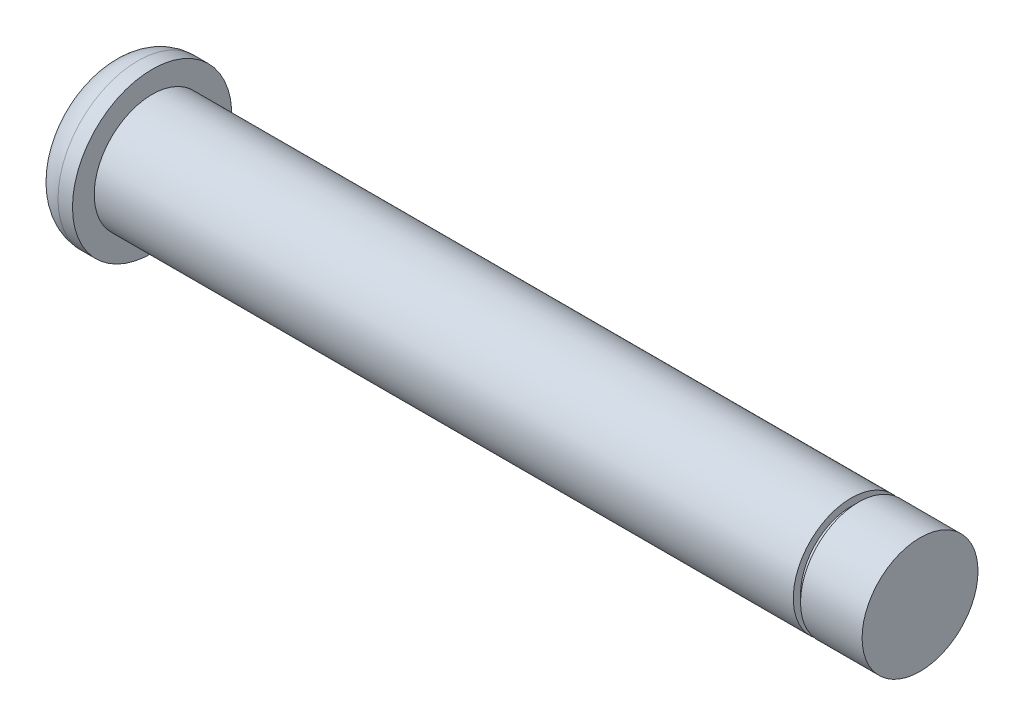
ISO-10303-21;
HEADER;
FILE_DESCRIPTION(('STEP AP214'),'2;1');
FILE_NAME('part.step','',(''),(''),'','','');
FILE_SCHEMA(('AUTOMOTIVE_DESIGN { 1 0 10303 214 1 1 1 1 }'));
ENDSEC;
DATA;
#1=APPLICATION_CONTEXT('core data for automotive mechanical design processes');
#2=APPLICATION_PROTOCOL_DEFINITION('international standard','automotive_design',2000,#1);
#3=PRODUCT_CONTEXT('',#1,'mechanical');
#4=PRODUCT('Part','Part','',(#3));
#5=PRODUCT_RELATED_PRODUCT_CATEGORY('part','',(#4));
#6=PRODUCT_DEFINITION_FORMATION('','',#4);
#7=PRODUCT_DEFINITION_CONTEXT('part definition',#1,'design');
#8=PRODUCT_DEFINITION('design','',#6,#7);
#9=PRODUCT_DEFINITION_SHAPE('','',#8);
#10=(LENGTH_UNIT() NAMED_UNIT(*) SI_UNIT(.MILLI.,.METRE.));
#11=(NAMED_UNIT(*) PLANE_ANGLE_UNIT() SI_UNIT($,.RADIAN.));
#12=(NAMED_UNIT(*) SI_UNIT($,.STERADIAN.) SOLID_ANGLE_UNIT());
#13=UNCERTAINTY_MEASURE_WITH_UNIT(LENGTH_MEASURE(1.E-05),#10,'distance_accuracy_value','');
#14=(GEOMETRIC_REPRESENTATION_CONTEXT(3) GLOBAL_UNCERTAINTY_ASSIGNED_CONTEXT((#13)) GLOBAL_UNIT_ASSIGNED_CONTEXT((#10,
#11,#12)) REPRESENTATION_CONTEXT('',''));
#15=CARTESIAN_POINT('',(0.,0.,0.));
#16=DIRECTION('',(0.,0.,1.));
#17=DIRECTION('',(1.,0.,0.));
#18=AXIS2_PLACEMENT_3D('',#15,#16,#17);
#19=CARTESIAN_POINT('',(53.,0.,0.));
#20=DIRECTION('',(-1.,0.,0.));
#21=DIRECTION('',(0.,0.,1.));
#22=AXIS2_PLACEMENT_3D('',#19,#20,#21);
#23=CYLINDRICAL_SURFACE('',#22,4.);
#24=CARTESIAN_POINT('',(0.,0.,0.));
#25=DIRECTION('',(1.,0.,0.));
#26=DIRECTION('',(0.,0.,-1.));
#27=AXIS2_PLACEMENT_3D('',#24,#25,#26);
#28=CIRCLE('',#27,4.);
#29=CARTESIAN_POINT('',(0.,0.,-4.));
#30=VERTEX_POINT('',#29);
#31=EDGE_CURVE('E76',#30,#30,#28,.T.);
#32=ORIENTED_EDGE('',*,*,#31,.T.);
#33=EDGE_LOOP('',(#32));
#34=FACE_BOUND('',#33,.T.);
#35=CARTESIAN_POINT('',(48.25,0.,0.));
#36=DIRECTION('',(1.,0.,0.));
#37=DIRECTION('',(0.,0.,-1.));
#38=AXIS2_PLACEMENT_3D('',#35,#36,#37);
#39=CIRCLE('',#38,4.);
#40=CARTESIAN_POINT('',(48.25,0.,-4.));
#41=VERTEX_POINT('',#40);
#42=EDGE_CURVE('E59',#41,#41,#39,.T.);
#43=ORIENTED_EDGE('',*,*,#42,.F.);
#44=EDGE_LOOP('',(#43));
#45=FACE_BOUND('',#44,.T.);
#46=ADVANCED_FACE('F43',(#34,#45),#23,.T.);
#47=CARTESIAN_POINT('',(-3.,0.,0.));
#48=DIRECTION('',(1.,0.,0.));
#49=DIRECTION('',(0.,0.,-1.));
#50=AXIS2_PLACEMENT_3D('',#47,#48,#49);
#51=CYLINDRICAL_SURFACE('',#50,5.5);
#52=CARTESIAN_POINT('',(-1.,0.,0.));
#53=DIRECTION('',(-1.,0.,0.));
#54=DIRECTION('',(0.,0.,1.));
#55=AXIS2_PLACEMENT_3D('',#52,#53,#54);
#56=CIRCLE('',#55,5.5);
#57=CARTESIAN_POINT('',(-1.,0.,5.5));
#58=VERTEX_POINT('',#57);
#59=EDGE_CURVE('E10',#58,#58,#56,.F.);
#60=ORIENTED_EDGE('',*,*,#59,.T.);
#61=EDGE_LOOP('',(#60));
#62=FACE_BOUND('',#61,.T.);
#63=CARTESIAN_POINT('',(0.,0.,0.));
#64=DIRECTION('',(-1.,0.,0.));
#65=DIRECTION('',(0.,0.,1.));
#66=AXIS2_PLACEMENT_3D('',#63,#64,#65);
#67=CIRCLE('',#66,5.5);
#68=CARTESIAN_POINT('',(0.,0.,5.5));
#69=VERTEX_POINT('',#68);
#70=EDGE_CURVE('E65',#69,#69,#67,.T.);
#71=ORIENTED_EDGE('',*,*,#70,.T.);
#72=EDGE_LOOP('',(#71));
#73=FACE_BOUND('',#72,.T.);
#74=ADVANCED_FACE('F90',(#62,#73),#51,.T.);
#75=CARTESIAN_POINT('',(-3.,0.,0.));
#76=DIRECTION('',(-1.,0.,0.));
#77=DIRECTION('',(0.,0.,1.));
#78=AXIS2_PLACEMENT_3D('',#75,#76,#77);
#79=PLANE('',#78);
#80=CARTESIAN_POINT('',(-3.,0.,0.));
#81=DIRECTION('',(-1.,0.,0.));
#82=DIRECTION('',(0.,0.,1.));
#83=AXIS2_PLACEMENT_3D('',#80,#81,#82);
#84=CIRCLE('',#83,3.5);
#85=CARTESIAN_POINT('',(-3.,0.,3.5));
#86=VERTEX_POINT('',#85);
#87=EDGE_CURVE('E51',#86,#86,#84,.T.);
#88=ORIENTED_EDGE('',*,*,#87,.T.);
#89=EDGE_LOOP('',(#88));
#90=FACE_BOUND('',#89,.T.);
#91=ADVANCED_FACE('F86',(#90),#79,.T.);
#92=CARTESIAN_POINT('',(0.,0.,0.));
#93=DIRECTION('',(-1.,0.,0.));
#94=DIRECTION('',(0.,0.,1.));
#95=AXIS2_PLACEMENT_3D('',#92,#93,#94);
#96=PLANE('',#95);
#97=ORIENTED_EDGE('',*,*,#31,.F.);
#98=EDGE_LOOP('',(#97));
#99=FACE_BOUND('',#98,.T.);
#100=ORIENTED_EDGE('',*,*,#70,.F.);
#101=EDGE_LOOP('',(#100));
#102=FACE_BOUND('',#101,.T.);
#103=ADVANCED_FACE('F83',(#99,#102),#96,.F.);
#104=CARTESIAN_POINT('',(-1.,0.,0.));
#105=DIRECTION('',(-1.,0.,0.));
#106=DIRECTION('',(0.,0.,1.));
#107=AXIS2_PLACEMENT_3D('',#104,#105,#106);
#108=TOROIDAL_SURFACE('',#107,3.5,2.);
#109=ORIENTED_EDGE('',*,*,#59,.F.);
#110=EDGE_LOOP('',(#109));
#111=FACE_BOUND('',#110,.T.);
#112=ORIENTED_EDGE('',*,*,#87,.F.);
#113=EDGE_LOOP('',(#112));
#114=FACE_BOUND('',#113,.T.);
#115=ADVANCED_FACE('F45',(#111,#114),#108,.T.);
#116=CARTESIAN_POINT('',(48.75,4.5,0.));
#117=DIRECTION('',(-1.,0.,0.));
#118=DIRECTION('',(0.,0.,1.));
#119=AXIS2_PLACEMENT_3D('',#116,#117,#118);
#120=PLANE('',#119);
#121=CARTESIAN_POINT('',(48.75,0.,0.));
#122=DIRECTION('',(-1.,0.,0.));
#123=DIRECTION('',(0.,0.,1.));
#124=AXIS2_PLACEMENT_3D('',#121,#122,#123);
#125=CIRCLE('',#124,3.5);
#126=CARTESIAN_POINT('',(48.75,0.,3.5));
#127=VERTEX_POINT('',#126);
#128=EDGE_CURVE('E67',#127,#127,#125,.T.);
#129=ORIENTED_EDGE('',*,*,#128,.F.);
#130=EDGE_LOOP('',(#129));
#131=FACE_BOUND('',#130,.T.);
#132=CARTESIAN_POINT('',(48.75,0.,0.));
#133=DIRECTION('',(-1.,0.,0.));
#134=DIRECTION('',(0.,0.,1.));
#135=AXIS2_PLACEMENT_3D('',#132,#133,#134);
#136=CIRCLE('',#135,4.);
#137=CARTESIAN_POINT('',(48.75,0.,4.));
#138=VERTEX_POINT('',#137);
#139=EDGE_CURVE('E47',#138,#138,#136,.T.);
#140=ORIENTED_EDGE('',*,*,#139,.T.);
#141=EDGE_LOOP('',(#140));
#142=FACE_BOUND('',#141,.T.);
#143=ADVANCED_FACE('F114',(#131,#142),#120,.T.);
#144=CARTESIAN_POINT('',(48.25,4.5,0.));
#145=DIRECTION('',(1.,0.,0.));
#146=DIRECTION('',(0.,0.,-1.));
#147=AXIS2_PLACEMENT_3D('',#144,#145,#146);
#148=PLANE('',#147);
#149=CARTESIAN_POINT('',(48.25,0.,0.));
#150=DIRECTION('',(-1.,0.,0.));
#151=DIRECTION('',(0.,0.,1.));
#152=AXIS2_PLACEMENT_3D('',#149,#150,#151);
#153=CIRCLE('',#152,3.5);
#154=CARTESIAN_POINT('',(48.25,0.,3.5));
#155=VERTEX_POINT('',#154);
#156=EDGE_CURVE('E61',#155,#155,#153,.T.);
#157=ORIENTED_EDGE('',*,*,#156,.T.);
#158=EDGE_LOOP('',(#157));
#159=FACE_BOUND('',#158,.T.);
#160=ORIENTED_EDGE('',*,*,#42,.T.);
#161=EDGE_LOOP('',(#160));
#162=FACE_BOUND('',#161,.T.);
#163=ADVANCED_FACE('F116',(#159,#162),#148,.T.);
#164=CARTESIAN_POINT('',(0.,0.,0.));
#165=DIRECTION('',(-1.,0.,0.));
#166=DIRECTION('',(0.,0.,1.));
#167=AXIS2_PLACEMENT_3D('',#164,#165,#166);
#168=CYLINDRICAL_SURFACE('',#167,3.5);
#169=ORIENTED_EDGE('',*,*,#128,.T.);
#170=EDGE_LOOP('',(#169));
#171=FACE_BOUND('',#170,.T.);
#172=ORIENTED_EDGE('',*,*,#156,.F.);
#173=EDGE_LOOP('',(#172));
#174=FACE_BOUND('',#173,.T.);
#175=ADVANCED_FACE('F103',(#171,#174),#168,.T.);
#176=CARTESIAN_POINT('',(53.,0.,0.));
#177=DIRECTION('',(1.,0.,0.));
#178=DIRECTION('',(0.,0.,-1.));
#179=AXIS2_PLACEMENT_3D('',#176,#177,#178);
#180=PLANE('',#179);
#181=CARTESIAN_POINT('',(53.,0.,0.));
#182=DIRECTION('',(1.,0.,0.));
#183=DIRECTION('',(0.,0.,-1.));
#184=AXIS2_PLACEMENT_3D('',#181,#182,#183);
#185=CIRCLE('',#184,4.);
#186=CARTESIAN_POINT('',(53.,0.,-4.));
#187=VERTEX_POINT('',#186);
#188=EDGE_CURVE('E56',#187,#187,#185,.T.);
#189=ORIENTED_EDGE('',*,*,#188,.T.);
#190=EDGE_LOOP('',(#189));
#191=FACE_BOUND('',#190,.T.);
#192=ADVANCED_FACE('F101',(#191),#180,.T.);
#193=ORIENTED_EDGE('',*,*,#188,.F.);
#194=EDGE_LOOP('',(#193));
#195=FACE_BOUND('',#194,.T.);
#196=ORIENTED_EDGE('',*,*,#139,.F.);
#197=EDGE_LOOP('',(#196));
#198=FACE_BOUND('',#197,.T.);
#199=ADVANCED_FACE('F99',(#195,#198),#23,.T.);
#200=CLOSED_SHELL('',(#46,#74,#91,#103,#115,#143,#163,#175,#192,#199));
#201=MANIFOLD_SOLID_BREP('B2',#200);
#202=ADVANCED_BREP_SHAPE_REPRESENTATION('',(#18,#201),#14);
#203=SHAPE_DEFINITION_REPRESENTATION(#9,#202);
ENDSEC;
END-ISO-10303-21;
